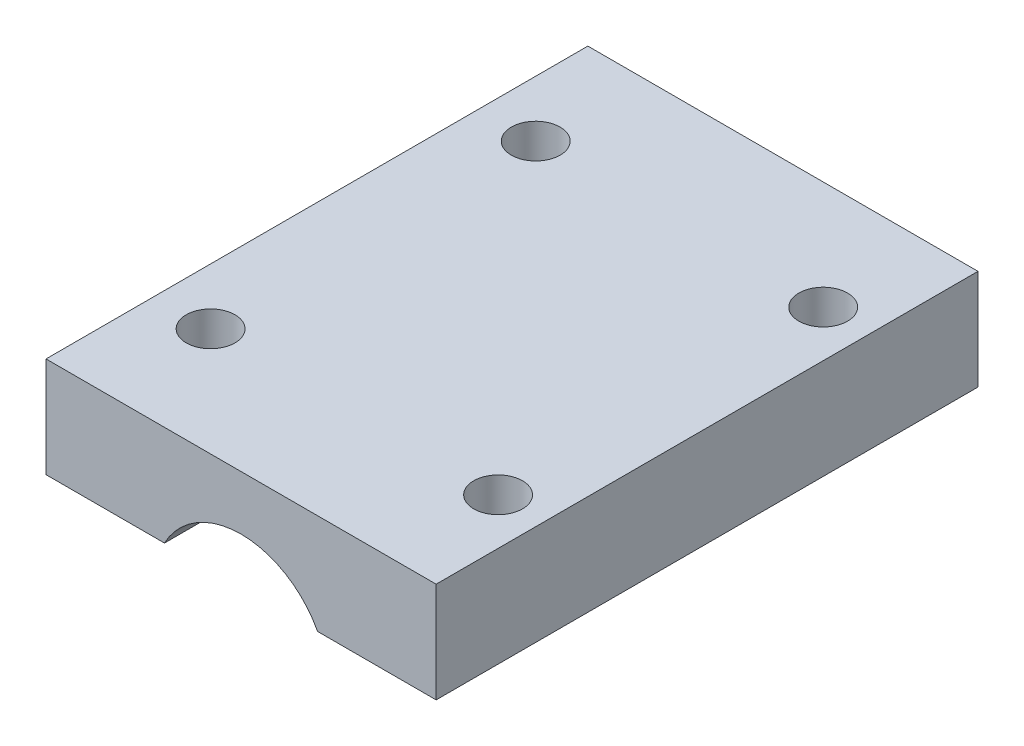
ISO-10303-21;
HEADER;
FILE_DESCRIPTION(('STEP AP214'),'2;1');
FILE_NAME('part.step','',(''),(''),'','','');
FILE_SCHEMA(('AUTOMOTIVE_DESIGN { 1 0 10303 214 1 1 1 1 }'));
ENDSEC;
DATA;
#1=APPLICATION_CONTEXT('core data for automotive mechanical design processes');
#2=APPLICATION_PROTOCOL_DEFINITION('international standard','automotive_design',2000,#1);
#3=PRODUCT_CONTEXT('',#1,'mechanical');
#4=PRODUCT('Part','Part','',(#3));
#5=PRODUCT_RELATED_PRODUCT_CATEGORY('part','',(#4));
#6=PRODUCT_DEFINITION_FORMATION('','',#4);
#7=PRODUCT_DEFINITION_CONTEXT('part definition',#1,'design');
#8=PRODUCT_DEFINITION('design','',#6,#7);
#9=PRODUCT_DEFINITION_SHAPE('','',#8);
#10=(LENGTH_UNIT() NAMED_UNIT(*) SI_UNIT(.MILLI.,.METRE.));
#11=(NAMED_UNIT(*) PLANE_ANGLE_UNIT() SI_UNIT($,.RADIAN.));
#12=(NAMED_UNIT(*) SI_UNIT($,.STERADIAN.) SOLID_ANGLE_UNIT());
#13=UNCERTAINTY_MEASURE_WITH_UNIT(LENGTH_MEASURE(1.E-05),#10,'distance_accuracy_value','');
#14=(GEOMETRIC_REPRESENTATION_CONTEXT(3) GLOBAL_UNCERTAINTY_ASSIGNED_CONTEXT((#13)) GLOBAL_UNIT_ASSIGNED_CONTEXT((#10,
#11,#12)) REPRESENTATION_CONTEXT('',''));
#15=CARTESIAN_POINT('',(0.,0.,0.));
#16=DIRECTION('',(0.,0.,1.));
#17=DIRECTION('',(1.,0.,0.));
#18=AXIS2_PLACEMENT_3D('',#15,#16,#17);
#19=CARTESIAN_POINT('',(0.,0.,50.));
#20=DIRECTION('',(0.,0.,1.));
#21=DIRECTION('',(1.,0.,0.));
#22=AXIS2_PLACEMENT_3D('',#19,#20,#21);
#23=PLANE('',#22);
#24=DIRECTION('',(1.,0.,0.));
#25=VECTOR('',#24,1.);
#26=CARTESIAN_POINT('',(-18.,3.75,50.));
#27=LINE('',#26,#25);
#28=CARTESIAN_POINT('',(7.06664701255128,3.75,50.));
#29=VERTEX_POINT('',#28);
#30=CARTESIAN_POINT('',(18.,3.75,50.));
#31=VERTEX_POINT('',#30);
#32=EDGE_CURVE('E58',#29,#31,#27,.T.);
#33=ORIENTED_EDGE('',*,*,#32,.T.);
#34=DIRECTION('',(0.,1.,0.));
#35=VECTOR('',#34,1.);
#36=CARTESIAN_POINT('',(18.,18.,50.));
#37=LINE('',#36,#35);
#38=CARTESIAN_POINT('',(18.,13.,50.));
#39=VERTEX_POINT('',#38);
#40=EDGE_CURVE('E42',#31,#39,#37,.T.);
#41=ORIENTED_EDGE('',*,*,#40,.T.);
#42=DIRECTION('',(1.,0.,0.));
#43=VECTOR('',#42,1.);
#44=CARTESIAN_POINT('',(-18.,13.,50.));
#45=LINE('',#44,#43);
#46=CARTESIAN_POINT('',(-18.,13.,50.));
#47=VERTEX_POINT('',#46);
#48=EDGE_CURVE('E130',#47,#39,#45,.T.);
#49=ORIENTED_EDGE('',*,*,#48,.F.);
#50=DIRECTION('',(0.,-1.,0.));
#51=VECTOR('',#50,1.);
#52=CARTESIAN_POINT('',(-18.,18.,50.));
#53=LINE('',#52,#51);
#54=CARTESIAN_POINT('',(-18.,3.75,50.));
#55=VERTEX_POINT('',#54);
#56=EDGE_CURVE('E11',#47,#55,#53,.T.);
#57=ORIENTED_EDGE('',*,*,#56,.T.);
#58=CARTESIAN_POINT('',(-7.06664701255129,3.75,50.));
#59=VERTEX_POINT('',#58);
#60=EDGE_CURVE('E99',#55,#59,#27,.T.);
#61=ORIENTED_EDGE('',*,*,#60,.T.);
#62=CARTESIAN_POINT('',(0.,0.,50.));
#63=DIRECTION('',(0.,0.,1.));
#64=DIRECTION('',(1.,0.,0.));
#65=AXIS2_PLACEMENT_3D('',#62,#63,#64);
#66=CIRCLE('',#65,8.);
#67=EDGE_CURVE('E87',#29,#59,#66,.T.);
#68=ORIENTED_EDGE('',*,*,#67,.F.);
#69=EDGE_LOOP('',(#33,#41,#49,#57,#61,#68));
#70=FACE_BOUND('',#69,.T.);
#71=ADVANCED_FACE('F33',(#70),#23,.T.);
#72=CARTESIAN_POINT('',(0.,0.,0.));
#73=DIRECTION('',(0.,0.,1.));
#74=DIRECTION('',(1.,0.,0.));
#75=AXIS2_PLACEMENT_3D('',#72,#73,#74);
#76=PLANE('',#75);
#77=DIRECTION('',(0.,1.,0.));
#78=VECTOR('',#77,1.);
#79=CARTESIAN_POINT('',(18.,18.,0.));
#80=LINE('',#79,#78);
#81=CARTESIAN_POINT('',(18.,3.75,0.));
#82=VERTEX_POINT('',#81);
#83=CARTESIAN_POINT('',(18.,13.,0.));
#84=VERTEX_POINT('',#83);
#85=EDGE_CURVE('E95',#82,#84,#80,.T.);
#86=ORIENTED_EDGE('',*,*,#85,.F.);
#87=DIRECTION('',(-1.,0.,0.));
#88=VECTOR('',#87,1.);
#89=CARTESIAN_POINT('',(0.,3.75,0.));
#90=LINE('',#89,#88);
#91=CARTESIAN_POINT('',(7.06664701255128,3.75,0.));
#92=VERTEX_POINT('',#91);
#93=EDGE_CURVE('E111',#82,#92,#90,.T.);
#94=ORIENTED_EDGE('',*,*,#93,.T.);
#95=CARTESIAN_POINT('',(0.,0.,0.));
#96=DIRECTION('',(0.,0.,1.));
#97=DIRECTION('',(1.,0.,0.));
#98=AXIS2_PLACEMENT_3D('',#95,#96,#97);
#99=CIRCLE('',#98,8.);
#100=CARTESIAN_POINT('',(-7.06664701255129,3.75,0.));
#101=VERTEX_POINT('',#100);
#102=EDGE_CURVE('E96',#92,#101,#99,.T.);
#103=ORIENTED_EDGE('',*,*,#102,.T.);
#104=CARTESIAN_POINT('',(-18.,3.75,0.));
#105=VERTEX_POINT('',#104);
#106=EDGE_CURVE('E107',#101,#105,#90,.T.);
#107=ORIENTED_EDGE('',*,*,#106,.T.);
#108=DIRECTION('',(0.,-1.,0.));
#109=VECTOR('',#108,1.);
#110=CARTESIAN_POINT('',(-18.,18.,0.));
#111=LINE('',#110,#109);
#112=CARTESIAN_POINT('',(-18.,13.,0.));
#113=VERTEX_POINT('',#112);
#114=EDGE_CURVE('E142',#113,#105,#111,.T.);
#115=ORIENTED_EDGE('',*,*,#114,.F.);
#116=DIRECTION('',(1.,0.,0.));
#117=VECTOR('',#116,1.);
#118=CARTESIAN_POINT('',(-18.,13.,0.));
#119=LINE('',#118,#117);
#120=EDGE_CURVE('E131',#113,#84,#119,.T.);
#121=ORIENTED_EDGE('',*,*,#120,.T.);
#122=EDGE_LOOP('',(#86,#94,#103,#107,#115,#121));
#123=FACE_BOUND('',#122,.T.);
#124=ADVANCED_FACE('F174',(#123),#76,.F.);
#125=CARTESIAN_POINT('',(18.,18.,50.));
#126=DIRECTION('',(-1.,0.,0.));
#127=DIRECTION('',(0.,-1.,0.));
#128=AXIS2_PLACEMENT_3D('',#125,#126,#127);
#129=PLANE('',#128);
#130=ORIENTED_EDGE('',*,*,#40,.F.);
#131=DIRECTION('',(0.,0.,-1.));
#132=VECTOR('',#131,1.);
#133=CARTESIAN_POINT('',(18.,3.75,50.));
#134=LINE('',#133,#132);
#135=EDGE_CURVE('E50',#31,#82,#134,.T.);
#136=ORIENTED_EDGE('',*,*,#135,.T.);
#137=ORIENTED_EDGE('',*,*,#85,.T.);
#138=DIRECTION('',(0.,0.,1.));
#139=VECTOR('',#138,1.);
#140=CARTESIAN_POINT('',(18.,13.,0.));
#141=LINE('',#140,#139);
#142=EDGE_CURVE('E137',#84,#39,#141,.T.);
#143=ORIENTED_EDGE('',*,*,#142,.T.);
#144=EDGE_LOOP('',(#130,#136,#137,#143));
#145=FACE_BOUND('',#144,.T.);
#146=ADVANCED_FACE('F35',(#145),#129,.F.);
#147=CARTESIAN_POINT('',(-18.,18.,50.));
#148=DIRECTION('',(1.,0.,0.));
#149=DIRECTION('',(0.,1.,0.));
#150=AXIS2_PLACEMENT_3D('',#147,#148,#149);
#151=PLANE('',#150);
#152=ORIENTED_EDGE('',*,*,#114,.T.);
#153=DIRECTION('',(0.,0.,-1.));
#154=VECTOR('',#153,1.);
#155=CARTESIAN_POINT('',(-18.,3.75,50.));
#156=LINE('',#155,#154);
#157=EDGE_CURVE('E149',#55,#105,#156,.T.);
#158=ORIENTED_EDGE('',*,*,#157,.F.);
#159=ORIENTED_EDGE('',*,*,#56,.F.);
#160=DIRECTION('',(0.,0.,1.));
#161=VECTOR('',#160,1.);
#162=CARTESIAN_POINT('',(-18.,13.,0.));
#163=LINE('',#162,#161);
#164=EDGE_CURVE('E134',#113,#47,#163,.T.);
#165=ORIENTED_EDGE('',*,*,#164,.F.);
#166=EDGE_LOOP('',(#152,#158,#159,#165));
#167=FACE_BOUND('',#166,.T.);
#168=ADVANCED_FACE('F148',(#167),#151,.F.);
#169=CARTESIAN_POINT('',(0.,0.,50.));
#170=DIRECTION('',(0.,0.,-1.));
#171=DIRECTION('',(-1.,0.,0.));
#172=AXIS2_PLACEMENT_3D('',#169,#170,#171);
#173=CYLINDRICAL_SURFACE('',#172,8.);
#174=DIRECTION('',(0.,0.,-1.));
#175=VECTOR('',#174,1.);
#176=CARTESIAN_POINT('',(7.06664701255128,3.75,50.));
#177=LINE('',#176,#175);
#178=EDGE_CURVE('E94',#29,#92,#177,.T.);
#179=ORIENTED_EDGE('',*,*,#178,.F.);
#180=ORIENTED_EDGE('',*,*,#67,.T.);
#181=DIRECTION('',(0.,0.,-1.));
#182=VECTOR('',#181,1.);
#183=CARTESIAN_POINT('',(-7.06664701255129,3.75,50.));
#184=LINE('',#183,#182);
#185=EDGE_CURVE('E91',#101,#59,#184,.F.);
#186=ORIENTED_EDGE('',*,*,#185,.F.);
#187=ORIENTED_EDGE('',*,*,#102,.F.);
#188=EDGE_LOOP('',(#179,#180,#186,#187));
#189=FACE_BOUND('',#188,.T.);
#190=ADVANCED_FACE('F89',(#189),#173,.F.);
#191=CARTESIAN_POINT('',(-18.,13.,0.));
#192=DIRECTION('',(0.,-1.,0.));
#193=DIRECTION('',(0.,0.,-1.));
#194=AXIS2_PLACEMENT_3D('',#191,#192,#193);
#195=PLANE('',#194);
#196=CARTESIAN_POINT('',(13.7183291249987,13.,40.));
#197=DIRECTION('',(0.,-1.,0.));
#198=DIRECTION('',(0.,0.,-1.));
#199=AXIS2_PLACEMENT_3D('',#196,#197,#198);
#200=CIRCLE('',#199,2.25);
#201=CARTESIAN_POINT('',(13.7183291249987,13.,37.75));
#202=VERTEX_POINT('',#201);
#203=EDGE_CURVE('E118',#202,#202,#200,.T.);
#204=ORIENTED_EDGE('',*,*,#203,.T.);
#205=EDGE_LOOP('',(#204));
#206=FACE_BOUND('',#205,.T.);
#207=CARTESIAN_POINT('',(13.7183291249987,13.,10.));
#208=DIRECTION('',(0.,-1.,0.));
#209=DIRECTION('',(0.,0.,-1.));
#210=AXIS2_PLACEMENT_3D('',#207,#208,#209);
#211=CIRCLE('',#210,2.25);
#212=CARTESIAN_POINT('',(13.7183291249987,13.,7.75));
#213=VERTEX_POINT('',#212);
#214=EDGE_CURVE('E121',#213,#213,#211,.T.);
#215=ORIENTED_EDGE('',*,*,#214,.T.);
#216=EDGE_LOOP('',(#215));
#217=FACE_BOUND('',#216,.T.);
#218=CARTESIAN_POINT('',(-12.8104985211385,13.,10.));
#219=DIRECTION('',(0.,-1.,0.));
#220=DIRECTION('',(0.,0.,-1.));
#221=AXIS2_PLACEMENT_3D('',#218,#219,#220);
#222=CIRCLE('',#221,2.25);
#223=CARTESIAN_POINT('',(-12.8104985211385,13.,7.75000000000001));
#224=VERTEX_POINT('',#223);
#225=EDGE_CURVE('E124',#224,#224,#222,.T.);
#226=ORIENTED_EDGE('',*,*,#225,.T.);
#227=EDGE_LOOP('',(#226));
#228=FACE_BOUND('',#227,.T.);
#229=CARTESIAN_POINT('',(-12.8104985211385,13.,40.));
#230=DIRECTION('',(0.,-1.,0.));
#231=DIRECTION('',(0.,0.,-1.));
#232=AXIS2_PLACEMENT_3D('',#229,#230,#231);
#233=CIRCLE('',#232,2.25);
#234=CARTESIAN_POINT('',(-12.8104985211385,13.,37.75));
#235=VERTEX_POINT('',#234);
#236=EDGE_CURVE('E127',#235,#235,#233,.T.);
#237=ORIENTED_EDGE('',*,*,#236,.T.);
#238=EDGE_LOOP('',(#237));
#239=FACE_BOUND('',#238,.T.);
#240=ORIENTED_EDGE('',*,*,#48,.T.);
#241=ORIENTED_EDGE('',*,*,#142,.F.);
#242=ORIENTED_EDGE('',*,*,#120,.F.);
#243=ORIENTED_EDGE('',*,*,#164,.T.);
#244=EDGE_LOOP('',(#240,#241,#242,#243));
#245=FACE_BOUND('',#244,.T.);
#246=ADVANCED_FACE('F187',(#206,#217,#228,#239,#245),#195,.F.);
#247=CARTESIAN_POINT('',(-12.8104985211385,-5.49999999999999,40.));
#248=DIRECTION('',(0.,-1.,0.));
#249=DIRECTION('',(0.,0.,-1.));
#250=AXIS2_PLACEMENT_3D('',#247,#248,#249);
#251=CYLINDRICAL_SURFACE('',#250,2.24999999999999);
#252=CARTESIAN_POINT('',(-12.8104985211385,3.75,40.));
#253=DIRECTION('',(0.,1.,0.));
#254=DIRECTION('',(0.,0.,1.));
#255=AXIS2_PLACEMENT_3D('',#252,#253,#254);
#256=CIRCLE('',#255,2.24999999999999);
#257=CARTESIAN_POINT('',(-12.8104985211385,3.75,42.25));
#258=VERTEX_POINT('',#257);
#259=EDGE_CURVE('E108',#258,#258,#256,.F.);
#260=ORIENTED_EDGE('',*,*,#259,.T.);
#261=EDGE_LOOP('',(#260));
#262=FACE_BOUND('',#261,.T.);
#263=ORIENTED_EDGE('',*,*,#236,.F.);
#264=EDGE_LOOP('',(#263));
#265=FACE_BOUND('',#264,.T.);
#266=ADVANCED_FACE('F205',(#262,#265),#251,.F.);
#267=CARTESIAN_POINT('',(-12.8104985211385,-5.49999999999999,10.));
#268=DIRECTION('',(0.,-1.,0.));
#269=DIRECTION('',(0.,0.,-1.));
#270=AXIS2_PLACEMENT_3D('',#267,#268,#269);
#271=CYLINDRICAL_SURFACE('',#270,2.24999999999999);
#272=CARTESIAN_POINT('',(-12.8104985211385,3.75,10.));
#273=DIRECTION('',(0.,1.,0.));
#274=DIRECTION('',(0.,0.,1.));
#275=AXIS2_PLACEMENT_3D('',#272,#273,#274);
#276=CIRCLE('',#275,2.24999999999999);
#277=CARTESIAN_POINT('',(-12.8104985211385,3.75,12.25));
#278=VERTEX_POINT('',#277);
#279=EDGE_CURVE('E113',#278,#278,#276,.F.);
#280=ORIENTED_EDGE('',*,*,#279,.T.);
#281=EDGE_LOOP('',(#280));
#282=FACE_BOUND('',#281,.T.);
#283=ORIENTED_EDGE('',*,*,#225,.F.);
#284=EDGE_LOOP('',(#283));
#285=FACE_BOUND('',#284,.T.);
#286=ADVANCED_FACE('F159',(#282,#285),#271,.F.);
#287=CARTESIAN_POINT('',(13.7183291249987,-5.5,10.));
#288=DIRECTION('',(0.,-1.,0.));
#289=DIRECTION('',(0.,0.,-1.));
#290=AXIS2_PLACEMENT_3D('',#287,#288,#289);
#291=CYLINDRICAL_SURFACE('',#290,2.24999999999999);
#292=CARTESIAN_POINT('',(13.7183291249987,3.75,10.));
#293=DIRECTION('',(0.,1.,0.));
#294=DIRECTION('',(0.,0.,1.));
#295=AXIS2_PLACEMENT_3D('',#292,#293,#294);
#296=CIRCLE('',#295,2.24999999999999);
#297=CARTESIAN_POINT('',(13.7183291249987,3.75,12.25));
#298=VERTEX_POINT('',#297);
#299=EDGE_CURVE('E154',#298,#298,#296,.F.);
#300=ORIENTED_EDGE('',*,*,#299,.T.);
#301=EDGE_LOOP('',(#300));
#302=FACE_BOUND('',#301,.T.);
#303=ORIENTED_EDGE('',*,*,#214,.F.);
#304=EDGE_LOOP('',(#303));
#305=FACE_BOUND('',#304,.T.);
#306=ADVANCED_FACE('F200',(#302,#305),#291,.F.);
#307=CARTESIAN_POINT('',(13.7183291249987,-5.5,40.));
#308=DIRECTION('',(0.,-1.,0.));
#309=DIRECTION('',(0.,0.,-1.));
#310=AXIS2_PLACEMENT_3D('',#307,#308,#309);
#311=CYLINDRICAL_SURFACE('',#310,2.24999999999999);
#312=CARTESIAN_POINT('',(13.7183291249987,3.75,40.));
#313=DIRECTION('',(0.,1.,0.));
#314=DIRECTION('',(0.,0.,1.));
#315=AXIS2_PLACEMENT_3D('',#312,#313,#314);
#316=CIRCLE('',#315,2.24999999999999);
#317=CARTESIAN_POINT('',(13.7183291249987,3.75,42.25));
#318=VERTEX_POINT('',#317);
#319=EDGE_CURVE('E37',#318,#318,#316,.F.);
#320=ORIENTED_EDGE('',*,*,#319,.T.);
#321=EDGE_LOOP('',(#320));
#322=FACE_BOUND('',#321,.T.);
#323=ORIENTED_EDGE('',*,*,#203,.F.);
#324=EDGE_LOOP('',(#323));
#325=FACE_BOUND('',#324,.T.);
#326=ADVANCED_FACE('F169',(#322,#325),#311,.F.);
#327=CARTESIAN_POINT('',(-18.,3.75,50.));
#328=DIRECTION('',(0.,1.,0.));
#329=DIRECTION('',(0.,0.,1.));
#330=AXIS2_PLACEMENT_3D('',#327,#328,#329);
#331=PLANE('',#330);
#332=ORIENTED_EDGE('',*,*,#299,.F.);
#333=EDGE_LOOP('',(#332));
#334=FACE_BOUND('',#333,.T.);
#335=ORIENTED_EDGE('',*,*,#319,.F.);
#336=EDGE_LOOP('',(#335));
#337=FACE_BOUND('',#336,.T.);
#338=ORIENTED_EDGE('',*,*,#93,.F.);
#339=ORIENTED_EDGE('',*,*,#135,.F.);
#340=ORIENTED_EDGE('',*,*,#32,.F.);
#341=ORIENTED_EDGE('',*,*,#178,.T.);
#342=EDGE_LOOP('',(#338,#339,#340,#341));
#343=FACE_BOUND('',#342,.T.);
#344=ADVANCED_FACE('F163',(#334,#337,#343),#331,.F.);
#345=ORIENTED_EDGE('',*,*,#259,.F.);
#346=EDGE_LOOP('',(#345));
#347=FACE_BOUND('',#346,.T.);
#348=ORIENTED_EDGE('',*,*,#279,.F.);
#349=EDGE_LOOP('',(#348));
#350=FACE_BOUND('',#349,.T.);
#351=ORIENTED_EDGE('',*,*,#106,.F.);
#352=ORIENTED_EDGE('',*,*,#185,.T.);
#353=ORIENTED_EDGE('',*,*,#60,.F.);
#354=ORIENTED_EDGE('',*,*,#157,.T.);
#355=EDGE_LOOP('',(#351,#352,#353,#354));
#356=FACE_BOUND('',#355,.T.);
#357=ADVANCED_FACE('F106',(#347,#350,#356),#331,.F.);
#358=CLOSED_SHELL('',(#71,#124,#146,#168,#190,#246,#266,#286,#306,#326,#344,#357));
#359=MANIFOLD_SOLID_BREP('B2',#358);
#360=ADVANCED_BREP_SHAPE_REPRESENTATION('',(#18,#359),#14);
#361=SHAPE_DEFINITION_REPRESENTATION(#9,#360);
ENDSEC;
END-ISO-10303-21;
